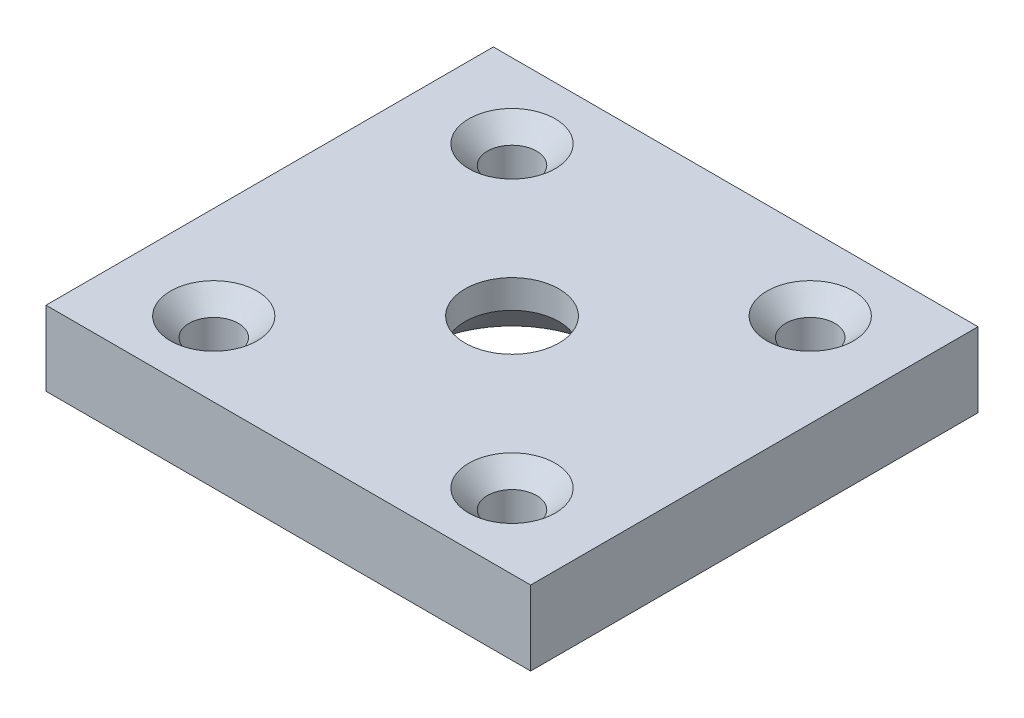
ISO-10303-21;
HEADER;
FILE_DESCRIPTION(('STEP AP214'),'2;1');
FILE_NAME('part.step','',(''),(''),'','','');
FILE_SCHEMA(('AUTOMOTIVE_DESIGN { 1 0 10303 214 1 1 1 1 }'));
ENDSEC;
DATA;
#1=APPLICATION_CONTEXT('core data for automotive mechanical design processes');
#2=APPLICATION_PROTOCOL_DEFINITION('international standard','automotive_design',2000,#1);
#3=PRODUCT_CONTEXT('',#1,'mechanical');
#4=PRODUCT('Part','Part','',(#3));
#5=PRODUCT_RELATED_PRODUCT_CATEGORY('part','',(#4));
#6=PRODUCT_DEFINITION_FORMATION('','',#4);
#7=PRODUCT_DEFINITION_CONTEXT('part definition',#1,'design');
#8=PRODUCT_DEFINITION('design','',#6,#7);
#9=PRODUCT_DEFINITION_SHAPE('','',#8);
#10=(LENGTH_UNIT() NAMED_UNIT(*) SI_UNIT(.MILLI.,.METRE.));
#11=(NAMED_UNIT(*) PLANE_ANGLE_UNIT() SI_UNIT($,.RADIAN.));
#12=(NAMED_UNIT(*) SI_UNIT($,.STERADIAN.) SOLID_ANGLE_UNIT());
#13=UNCERTAINTY_MEASURE_WITH_UNIT(LENGTH_MEASURE(1.E-05),#10,'distance_accuracy_value','');
#14=(GEOMETRIC_REPRESENTATION_CONTEXT(3) GLOBAL_UNCERTAINTY_ASSIGNED_CONTEXT((#13)) GLOBAL_UNIT_ASSIGNED_CONTEXT((#10,
#11,#12)) REPRESENTATION_CONTEXT('',''));
#15=CARTESIAN_POINT('',(0.,0.,0.));
#16=DIRECTION('',(0.,0.,1.));
#17=DIRECTION('',(1.,0.,0.));
#18=AXIS2_PLACEMENT_3D('',#15,#16,#17);
#19=CARTESIAN_POINT('',(16.25,5.,15.));
#20=DIRECTION('',(-1.,0.,0.));
#21=DIRECTION('',(0.,0.,1.));
#22=AXIS2_PLACEMENT_3D('',#19,#20,#21);
#23=PLANE('',#22);
#24=DIRECTION('',(0.,0.,-1.));
#25=VECTOR('',#24,1.);
#26=CARTESIAN_POINT('',(16.25,0.,15.));
#27=LINE('',#26,#25);
#28=CARTESIAN_POINT('',(16.25,0.,15.));
#29=VERTEX_POINT('',#28);
#30=CARTESIAN_POINT('',(16.25,0.,-15.));
#31=VERTEX_POINT('',#30);
#32=EDGE_CURVE('E96',#29,#31,#27,.T.);
#33=ORIENTED_EDGE('',*,*,#32,.T.);
#34=DIRECTION('',(0.,-1.,0.));
#35=VECTOR('',#34,1.);
#36=CARTESIAN_POINT('',(16.25,5.,-15.));
#37=LINE('',#36,#35);
#38=CARTESIAN_POINT('',(16.25,5.,-15.));
#39=VERTEX_POINT('',#38);
#40=EDGE_CURVE('E11',#39,#31,#37,.T.);
#41=ORIENTED_EDGE('',*,*,#40,.F.);
#42=DIRECTION('',(0.,0.,-1.));
#43=VECTOR('',#42,1.);
#44=CARTESIAN_POINT('',(16.25,5.,15.));
#45=LINE('',#44,#43);
#46=CARTESIAN_POINT('',(16.25,5.,15.));
#47=VERTEX_POINT('',#46);
#48=EDGE_CURVE('E84',#47,#39,#45,.T.);
#49=ORIENTED_EDGE('',*,*,#48,.F.);
#50=DIRECTION('',(0.,-1.,0.));
#51=VECTOR('',#50,1.);
#52=CARTESIAN_POINT('',(16.25,5.,15.));
#53=LINE('',#52,#51);
#54=EDGE_CURVE('E92',#47,#29,#53,.T.);
#55=ORIENTED_EDGE('',*,*,#54,.T.);
#56=EDGE_LOOP('',(#33,#41,#49,#55));
#57=FACE_BOUND('',#56,.T.);
#58=ADVANCED_FACE('F33',(#57),#23,.F.);
#59=CARTESIAN_POINT('',(-16.25,5.,-15.));
#60=DIRECTION('',(0.,0.,1.));
#61=DIRECTION('',(1.,0.,0.));
#62=AXIS2_PLACEMENT_3D('',#59,#60,#61);
#63=PLANE('',#62);
#64=DIRECTION('',(-1.,0.,0.));
#65=VECTOR('',#64,1.);
#66=CARTESIAN_POINT('',(-16.25,0.,-15.));
#67=LINE('',#66,#65);
#68=CARTESIAN_POINT('',(-16.25,0.,-15.));
#69=VERTEX_POINT('',#68);
#70=EDGE_CURVE('E88',#31,#69,#67,.T.);
#71=ORIENTED_EDGE('',*,*,#70,.T.);
#72=DIRECTION('',(0.,-1.,0.));
#73=VECTOR('',#72,1.);
#74=CARTESIAN_POINT('',(-16.25,5.,-15.));
#75=LINE('',#74,#73);
#76=CARTESIAN_POINT('',(-16.25,5.,-15.));
#77=VERTEX_POINT('',#76);
#78=EDGE_CURVE('E41',#77,#69,#75,.T.);
#79=ORIENTED_EDGE('',*,*,#78,.F.);
#80=DIRECTION('',(-1.,0.,0.));
#81=VECTOR('',#80,1.);
#82=CARTESIAN_POINT('',(-16.25,5.,-15.));
#83=LINE('',#82,#81);
#84=EDGE_CURVE('E79',#39,#77,#83,.T.);
#85=ORIENTED_EDGE('',*,*,#84,.F.);
#86=ORIENTED_EDGE('',*,*,#40,.T.);
#87=EDGE_LOOP('',(#71,#79,#85,#86));
#88=FACE_BOUND('',#87,.T.);
#89=ADVANCED_FACE('F87',(#88),#63,.F.);
#90=CARTESIAN_POINT('',(-16.25,5.,15.));
#91=DIRECTION('',(1.,0.,0.));
#92=DIRECTION('',(0.,0.,-1.));
#93=AXIS2_PLACEMENT_3D('',#90,#91,#92);
#94=PLANE('',#93);
#95=DIRECTION('',(0.,0.,1.));
#96=VECTOR('',#95,1.);
#97=CARTESIAN_POINT('',(-16.25,0.,15.));
#98=LINE('',#97,#96);
#99=CARTESIAN_POINT('',(-16.25,0.,15.));
#100=VERTEX_POINT('',#99);
#101=EDGE_CURVE('E66',#69,#100,#98,.T.);
#102=ORIENTED_EDGE('',*,*,#101,.T.);
#103=DIRECTION('',(0.,-1.,0.));
#104=VECTOR('',#103,1.);
#105=CARTESIAN_POINT('',(-16.25,5.,15.));
#106=LINE('',#105,#104);
#107=CARTESIAN_POINT('',(-16.25,5.,15.));
#108=VERTEX_POINT('',#107);
#109=EDGE_CURVE('E89',#108,#100,#106,.T.);
#110=ORIENTED_EDGE('',*,*,#109,.F.);
#111=DIRECTION('',(0.,0.,1.));
#112=VECTOR('',#111,1.);
#113=CARTESIAN_POINT('',(-16.25,5.,15.));
#114=LINE('',#113,#112);
#115=EDGE_CURVE('E82',#77,#108,#114,.T.);
#116=ORIENTED_EDGE('',*,*,#115,.F.);
#117=ORIENTED_EDGE('',*,*,#78,.T.);
#118=EDGE_LOOP('',(#102,#110,#116,#117));
#119=FACE_BOUND('',#118,.T.);
#120=ADVANCED_FACE('F90',(#119),#94,.F.);
#121=CARTESIAN_POINT('',(-16.25,5.,15.));
#122=DIRECTION('',(0.,0.,-1.));
#123=DIRECTION('',(-1.,0.,0.));
#124=AXIS2_PLACEMENT_3D('',#121,#122,#123);
#125=PLANE('',#124);
#126=DIRECTION('',(1.,0.,0.));
#127=VECTOR('',#126,1.);
#128=CARTESIAN_POINT('',(-16.25,0.,15.));
#129=LINE('',#128,#127);
#130=EDGE_CURVE('E72',#100,#29,#129,.T.);
#131=ORIENTED_EDGE('',*,*,#130,.T.);
#132=ORIENTED_EDGE('',*,*,#54,.F.);
#133=DIRECTION('',(1.,0.,0.));
#134=VECTOR('',#133,1.);
#135=CARTESIAN_POINT('',(-16.25,5.,15.));
#136=LINE('',#135,#134);
#137=EDGE_CURVE('E49',#108,#47,#136,.T.);
#138=ORIENTED_EDGE('',*,*,#137,.F.);
#139=ORIENTED_EDGE('',*,*,#109,.T.);
#140=EDGE_LOOP('',(#131,#132,#138,#139));
#141=FACE_BOUND('',#140,.T.);
#142=ADVANCED_FACE('F104',(#141),#125,.F.);
#143=CARTESIAN_POINT('',(0.,5.,0.));
#144=DIRECTION('',(0.,-1.,0.));
#145=DIRECTION('',(0.,0.,-1.));
#146=AXIS2_PLACEMENT_3D('',#143,#144,#145);
#147=PLANE('',#146);
#148=CARTESIAN_POINT('',(10.,5.,10.));
#149=DIRECTION('',(0.,1.,0.));
#150=DIRECTION('',(0.,0.,1.));
#151=AXIS2_PLACEMENT_3D('',#148,#149,#150);
#152=CIRCLE('',#151,2.9);
#153=CARTESIAN_POINT('',(10.,5.,12.9));
#154=VERTEX_POINT('',#153);
#155=EDGE_CURVE('E151',#154,#154,#152,.T.);
#156=ORIENTED_EDGE('',*,*,#155,.F.);
#157=EDGE_LOOP('',(#156));
#158=FACE_BOUND('',#157,.T.);
#159=CARTESIAN_POINT('',(-10.,5.,-10.));
#160=DIRECTION('',(0.,1.,0.));
#161=DIRECTION('',(0.,0.,1.));
#162=AXIS2_PLACEMENT_3D('',#159,#160,#161);
#163=CIRCLE('',#162,2.9);
#164=CARTESIAN_POINT('',(-10.,5.,-7.1));
#165=VERTEX_POINT('',#164);
#166=EDGE_CURVE('E142',#165,#165,#163,.T.);
#167=ORIENTED_EDGE('',*,*,#166,.F.);
#168=EDGE_LOOP('',(#167));
#169=FACE_BOUND('',#168,.T.);
#170=CARTESIAN_POINT('',(-10.,5.,10.));
#171=DIRECTION('',(0.,1.,0.));
#172=DIRECTION('',(0.,0.,1.));
#173=AXIS2_PLACEMENT_3D('',#170,#171,#172);
#174=CIRCLE('',#173,2.9);
#175=CARTESIAN_POINT('',(-10.,5.,12.9));
#176=VERTEX_POINT('',#175);
#177=EDGE_CURVE('E133',#176,#176,#174,.T.);
#178=ORIENTED_EDGE('',*,*,#177,.F.);
#179=EDGE_LOOP('',(#178));
#180=FACE_BOUND('',#179,.T.);
#181=CARTESIAN_POINT('',(10.,5.,-10.));
#182=DIRECTION('',(0.,1.,0.));
#183=DIRECTION('',(0.,0.,1.));
#184=AXIS2_PLACEMENT_3D('',#181,#182,#183);
#185=CIRCLE('',#184,2.9);
#186=CARTESIAN_POINT('',(10.,5.,-7.1));
#187=VERTEX_POINT('',#186);
#188=EDGE_CURVE('E124',#187,#187,#185,.T.);
#189=ORIENTED_EDGE('',*,*,#188,.F.);
#190=EDGE_LOOP('',(#189));
#191=FACE_BOUND('',#190,.T.);
#192=CARTESIAN_POINT('',(0.,5.,0.));
#193=DIRECTION('',(0.,-1.,0.));
#194=DIRECTION('',(0.,0.,-1.));
#195=AXIS2_PLACEMENT_3D('',#192,#193,#194);
#196=CIRCLE('',#195,3.15);
#197=CARTESIAN_POINT('',(0.,5.,-3.15));
#198=VERTEX_POINT('',#197);
#199=EDGE_CURVE('E99',#198,#198,#196,.T.);
#200=ORIENTED_EDGE('',*,*,#199,.T.);
#201=EDGE_LOOP('',(#200));
#202=FACE_BOUND('',#201,.T.);
#203=ORIENTED_EDGE('',*,*,#48,.T.);
#204=ORIENTED_EDGE('',*,*,#84,.T.);
#205=ORIENTED_EDGE('',*,*,#115,.T.);
#206=ORIENTED_EDGE('',*,*,#137,.T.);
#207=EDGE_LOOP('',(#203,#204,#205,#206));
#208=FACE_BOUND('',#207,.T.);
#209=ADVANCED_FACE('F80',(#158,#169,#180,#191,#202,#208),#147,.F.);
#210=CARTESIAN_POINT('',(0.,0.,0.));
#211=DIRECTION('',(0.,-1.,0.));
#212=DIRECTION('',(0.,0.,-1.));
#213=AXIS2_PLACEMENT_3D('',#210,#211,#212);
#214=PLANE('',#213);
#215=CARTESIAN_POINT('',(10.,0.,10.));
#216=DIRECTION('',(0.,1.,0.));
#217=DIRECTION('',(0.,0.,1.));
#218=AXIS2_PLACEMENT_3D('',#215,#216,#217);
#219=CIRCLE('',#218,1.65);
#220=CARTESIAN_POINT('',(10.,0.,11.65));
#221=VERTEX_POINT('',#220);
#222=EDGE_CURVE('E145',#221,#221,#219,.T.);
#223=ORIENTED_EDGE('',*,*,#222,.T.);
#224=EDGE_LOOP('',(#223));
#225=FACE_BOUND('',#224,.T.);
#226=CARTESIAN_POINT('',(-10.,0.,-10.));
#227=DIRECTION('',(0.,1.,0.));
#228=DIRECTION('',(0.,0.,1.));
#229=AXIS2_PLACEMENT_3D('',#226,#227,#228);
#230=CIRCLE('',#229,1.65);
#231=CARTESIAN_POINT('',(-10.,0.,-8.35));
#232=VERTEX_POINT('',#231);
#233=EDGE_CURVE('E136',#232,#232,#230,.T.);
#234=ORIENTED_EDGE('',*,*,#233,.T.);
#235=EDGE_LOOP('',(#234));
#236=FACE_BOUND('',#235,.T.);
#237=CARTESIAN_POINT('',(-10.,0.,10.));
#238=DIRECTION('',(0.,1.,0.));
#239=DIRECTION('',(0.,0.,1.));
#240=AXIS2_PLACEMENT_3D('',#237,#238,#239);
#241=CIRCLE('',#240,1.65);
#242=CARTESIAN_POINT('',(-10.,0.,11.65));
#243=VERTEX_POINT('',#242);
#244=EDGE_CURVE('E127',#243,#243,#241,.T.);
#245=ORIENTED_EDGE('',*,*,#244,.T.);
#246=EDGE_LOOP('',(#245));
#247=FACE_BOUND('',#246,.T.);
#248=CARTESIAN_POINT('',(10.,0.,-10.));
#249=DIRECTION('',(0.,1.,0.));
#250=DIRECTION('',(0.,0.,1.));
#251=AXIS2_PLACEMENT_3D('',#248,#249,#250);
#252=CIRCLE('',#251,1.65);
#253=CARTESIAN_POINT('',(10.,0.,-8.35));
#254=VERTEX_POINT('',#253);
#255=EDGE_CURVE('E118',#254,#254,#252,.T.);
#256=ORIENTED_EDGE('',*,*,#255,.T.);
#257=EDGE_LOOP('',(#256));
#258=FACE_BOUND('',#257,.T.);
#259=CARTESIAN_POINT('',(0.,0.,0.));
#260=DIRECTION('',(0.,-1.,0.));
#261=DIRECTION('',(0.,0.,-1.));
#262=AXIS2_PLACEMENT_3D('',#259,#260,#261);
#263=CIRCLE('',#262,6.25);
#264=CARTESIAN_POINT('',(0.,0.,-6.25));
#265=VERTEX_POINT('',#264);
#266=EDGE_CURVE('E115',#265,#265,#263,.T.);
#267=ORIENTED_EDGE('',*,*,#266,.F.);
#268=EDGE_LOOP('',(#267));
#269=FACE_BOUND('',#268,.T.);
#270=ORIENTED_EDGE('',*,*,#32,.F.);
#271=ORIENTED_EDGE('',*,*,#130,.F.);
#272=ORIENTED_EDGE('',*,*,#101,.F.);
#273=ORIENTED_EDGE('',*,*,#70,.F.);
#274=EDGE_LOOP('',(#270,#271,#272,#273));
#275=FACE_BOUND('',#274,.T.);
#276=ADVANCED_FACE('F107',(#225,#236,#247,#258,#269,#275),#214,.T.);
#277=CARTESIAN_POINT('',(0.,0.,0.));
#278=DIRECTION('',(0.,-1.,0.));
#279=DIRECTION('',(0.,0.,-1.));
#280=AXIS2_PLACEMENT_3D('',#277,#278,#279);
#281=CYLINDRICAL_SURFACE('',#280,3.14999999999999);
#282=ORIENTED_EDGE('',*,*,#199,.F.);
#283=EDGE_LOOP('',(#282));
#284=FACE_BOUND('',#283,.T.);
#285=CARTESIAN_POINT('',(0.,3.10000000000002,0.));
#286=DIRECTION('',(0.,-1.,0.));
#287=DIRECTION('',(0.,0.,-1.));
#288=AXIS2_PLACEMENT_3D('',#285,#286,#287);
#289=CIRCLE('',#288,3.14999999999999);
#290=CARTESIAN_POINT('',(0.,3.10000000000002,-3.14999999999999));
#291=VERTEX_POINT('',#290);
#292=EDGE_CURVE('E112',#291,#291,#289,.T.);
#293=ORIENTED_EDGE('',*,*,#292,.T.);
#294=EDGE_LOOP('',(#293));
#295=FACE_BOUND('',#294,.T.);
#296=ADVANCED_FACE('F168',(#284,#295),#281,.F.);
#297=CARTESIAN_POINT('',(0.,0.,0.));
#298=DIRECTION('',(0.,-1.,0.));
#299=DIRECTION('',(0.,0.,-1.));
#300=AXIS2_PLACEMENT_3D('',#297,#298,#299);
#301=CONICAL_SURFACE('',#300,6.25,0.785398163397447);
#302=ORIENTED_EDGE('',*,*,#292,.F.);
#303=EDGE_LOOP('',(#302));
#304=FACE_BOUND('',#303,.T.);
#305=ORIENTED_EDGE('',*,*,#266,.T.);
#306=EDGE_LOOP('',(#305));
#307=FACE_BOUND('',#306,.T.);
#308=ADVANCED_FACE('F171',(#304,#307),#301,.F.);
#309=CARTESIAN_POINT('',(10.,5.,-10.));
#310=DIRECTION('',(0.,1.,0.));
#311=DIRECTION('',(0.,0.,1.));
#312=AXIS2_PLACEMENT_3D('',#309,#310,#311);
#313=CYLINDRICAL_SURFACE('',#312,1.65);
#314=ORIENTED_EDGE('',*,*,#255,.F.);
#315=EDGE_LOOP('',(#314));
#316=FACE_BOUND('',#315,.T.);
#317=CARTESIAN_POINT('',(10.,3.75,-10.));
#318=DIRECTION('',(0.,1.,0.));
#319=DIRECTION('',(0.,0.,1.));
#320=AXIS2_PLACEMENT_3D('',#317,#318,#319);
#321=CIRCLE('',#320,1.65);
#322=CARTESIAN_POINT('',(10.,3.75,-8.35));
#323=VERTEX_POINT('',#322);
#324=EDGE_CURVE('E121',#323,#323,#321,.T.);
#325=ORIENTED_EDGE('',*,*,#324,.T.);
#326=EDGE_LOOP('',(#325));
#327=FACE_BOUND('',#326,.T.);
#328=ADVANCED_FACE('F177',(#316,#327),#313,.F.);
#329=CARTESIAN_POINT('',(10.,5.,-10.));
#330=DIRECTION('',(0.,1.,0.));
#331=DIRECTION('',(0.,0.,1.));
#332=AXIS2_PLACEMENT_3D('',#329,#330,#331);
#333=CONICAL_SURFACE('',#332,2.9,0.785398163397448);
#334=ORIENTED_EDGE('',*,*,#324,.F.);
#335=EDGE_LOOP('',(#334));
#336=FACE_BOUND('',#335,.T.);
#337=ORIENTED_EDGE('',*,*,#188,.T.);
#338=EDGE_LOOP('',(#337));
#339=FACE_BOUND('',#338,.T.);
#340=ADVANCED_FACE('F223',(#336,#339),#333,.F.);
#341=CARTESIAN_POINT('',(-10.,5.,10.));
#342=DIRECTION('',(0.,1.,0.));
#343=DIRECTION('',(0.,0.,1.));
#344=AXIS2_PLACEMENT_3D('',#341,#342,#343);
#345=CYLINDRICAL_SURFACE('',#344,1.65);
#346=ORIENTED_EDGE('',*,*,#244,.F.);
#347=EDGE_LOOP('',(#346));
#348=FACE_BOUND('',#347,.T.);
#349=CARTESIAN_POINT('',(-10.,3.75,10.));
#350=DIRECTION('',(0.,1.,0.));
#351=DIRECTION('',(0.,0.,1.));
#352=AXIS2_PLACEMENT_3D('',#349,#350,#351);
#353=CIRCLE('',#352,1.65);
#354=CARTESIAN_POINT('',(-10.,3.75,11.65));
#355=VERTEX_POINT('',#354);
#356=EDGE_CURVE('E130',#355,#355,#353,.T.);
#357=ORIENTED_EDGE('',*,*,#356,.T.);
#358=EDGE_LOOP('',(#357));
#359=FACE_BOUND('',#358,.T.);
#360=ADVANCED_FACE('F233',(#348,#359),#345,.F.);
#361=CARTESIAN_POINT('',(-10.,5.,10.));
#362=DIRECTION('',(0.,1.,0.));
#363=DIRECTION('',(0.,0.,1.));
#364=AXIS2_PLACEMENT_3D('',#361,#362,#363);
#365=CONICAL_SURFACE('',#364,2.9,0.785398163397448);
#366=ORIENTED_EDGE('',*,*,#356,.F.);
#367=EDGE_LOOP('',(#366));
#368=FACE_BOUND('',#367,.T.);
#369=ORIENTED_EDGE('',*,*,#177,.T.);
#370=EDGE_LOOP('',(#369));
#371=FACE_BOUND('',#370,.T.);
#372=ADVANCED_FACE('F243',(#368,#371),#365,.F.);
#373=CARTESIAN_POINT('',(-10.,5.,-10.));
#374=DIRECTION('',(0.,1.,0.));
#375=DIRECTION('',(0.,0.,1.));
#376=AXIS2_PLACEMENT_3D('',#373,#374,#375);
#377=CYLINDRICAL_SURFACE('',#376,1.65);
#378=ORIENTED_EDGE('',*,*,#233,.F.);
#379=EDGE_LOOP('',(#378));
#380=FACE_BOUND('',#379,.T.);
#381=CARTESIAN_POINT('',(-10.,3.75,-10.));
#382=DIRECTION('',(0.,1.,0.));
#383=DIRECTION('',(0.,0.,1.));
#384=AXIS2_PLACEMENT_3D('',#381,#382,#383);
#385=CIRCLE('',#384,1.65);
#386=CARTESIAN_POINT('',(-10.,3.75,-8.35));
#387=VERTEX_POINT('',#386);
#388=EDGE_CURVE('E139',#387,#387,#385,.T.);
#389=ORIENTED_EDGE('',*,*,#388,.T.);
#390=EDGE_LOOP('',(#389));
#391=FACE_BOUND('',#390,.T.);
#392=ADVANCED_FACE('F253',(#380,#391),#377,.F.);
#393=CARTESIAN_POINT('',(-10.,5.,-10.));
#394=DIRECTION('',(0.,1.,0.));
#395=DIRECTION('',(0.,0.,1.));
#396=AXIS2_PLACEMENT_3D('',#393,#394,#395);
#397=CONICAL_SURFACE('',#396,2.9,0.785398163397448);
#398=ORIENTED_EDGE('',*,*,#388,.F.);
#399=EDGE_LOOP('',(#398));
#400=FACE_BOUND('',#399,.T.);
#401=ORIENTED_EDGE('',*,*,#166,.T.);
#402=EDGE_LOOP('',(#401));
#403=FACE_BOUND('',#402,.T.);
#404=ADVANCED_FACE('F263',(#400,#403),#397,.F.);
#405=CARTESIAN_POINT('',(10.,5.,10.));
#406=DIRECTION('',(0.,1.,0.));
#407=DIRECTION('',(0.,0.,1.));
#408=AXIS2_PLACEMENT_3D('',#405,#406,#407);
#409=CYLINDRICAL_SURFACE('',#408,1.65);
#410=ORIENTED_EDGE('',*,*,#222,.F.);
#411=EDGE_LOOP('',(#410));
#412=FACE_BOUND('',#411,.T.);
#413=CARTESIAN_POINT('',(10.,3.75,10.));
#414=DIRECTION('',(0.,1.,0.));
#415=DIRECTION('',(0.,0.,1.));
#416=AXIS2_PLACEMENT_3D('',#413,#414,#415);
#417=CIRCLE('',#416,1.65);
#418=CARTESIAN_POINT('',(10.,3.75,11.65));
#419=VERTEX_POINT('',#418);
#420=EDGE_CURVE('E148',#419,#419,#417,.T.);
#421=ORIENTED_EDGE('',*,*,#420,.T.);
#422=EDGE_LOOP('',(#421));
#423=FACE_BOUND('',#422,.T.);
#424=ADVANCED_FACE('F273',(#412,#423),#409,.F.);
#425=CARTESIAN_POINT('',(10.,5.,10.));
#426=DIRECTION('',(0.,1.,0.));
#427=DIRECTION('',(0.,0.,1.));
#428=AXIS2_PLACEMENT_3D('',#425,#426,#427);
#429=CONICAL_SURFACE('',#428,2.9,0.785398163397448);
#430=ORIENTED_EDGE('',*,*,#420,.F.);
#431=EDGE_LOOP('',(#430));
#432=FACE_BOUND('',#431,.T.);
#433=ORIENTED_EDGE('',*,*,#155,.T.);
#434=EDGE_LOOP('',(#433));
#435=FACE_BOUND('',#434,.T.);
#436=ADVANCED_FACE('F155',(#432,#435),#429,.F.);
#437=CLOSED_SHELL('',(#58,#89,#120,#142,#209,#276,#296,#308,#328,#340,#360,#372,#392,#404,#424,#436));
#438=MANIFOLD_SOLID_BREP('B2',#437);
#439=ADVANCED_BREP_SHAPE_REPRESENTATION('',(#18,#438),#14);
#440=SHAPE_DEFINITION_REPRESENTATION(#9,#439);
ENDSEC;
END-ISO-10303-21;
